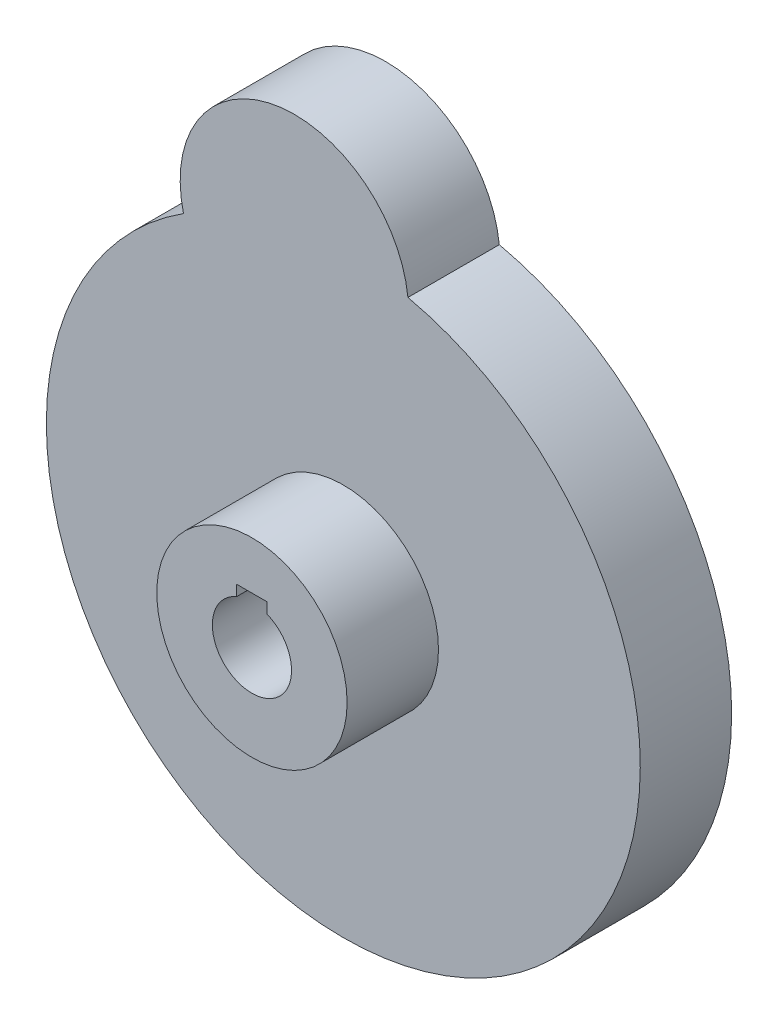
ISO-10303-21;
HEADER;
FILE_DESCRIPTION(('STEP AP214'),'2;1');
FILE_NAME('part.step','',(''),(''),'','','');
FILE_SCHEMA(('AUTOMOTIVE_DESIGN { 1 0 10303 214 1 1 1 1 }'));
ENDSEC;
DATA;
#1=APPLICATION_CONTEXT('core data for automotive mechanical design processes');
#2=APPLICATION_PROTOCOL_DEFINITION('international standard','automotive_design',2000,#1);
#3=PRODUCT_CONTEXT('',#1,'mechanical');
#4=PRODUCT('Part','Part','',(#3));
#5=PRODUCT_RELATED_PRODUCT_CATEGORY('part','',(#4));
#6=PRODUCT_DEFINITION_FORMATION('','',#4);
#7=PRODUCT_DEFINITION_CONTEXT('part definition',#1,'design');
#8=PRODUCT_DEFINITION('design','',#6,#7);
#9=PRODUCT_DEFINITION_SHAPE('','',#8);
#10=(LENGTH_UNIT() NAMED_UNIT(*) SI_UNIT(.MILLI.,.METRE.));
#11=(NAMED_UNIT(*) PLANE_ANGLE_UNIT() SI_UNIT($,.RADIAN.));
#12=(NAMED_UNIT(*) SI_UNIT($,.STERADIAN.) SOLID_ANGLE_UNIT());
#13=UNCERTAINTY_MEASURE_WITH_UNIT(LENGTH_MEASURE(1.E-05),#10,'distance_accuracy_value','');
#14=(GEOMETRIC_REPRESENTATION_CONTEXT(3) GLOBAL_UNCERTAINTY_ASSIGNED_CONTEXT((#13)) GLOBAL_UNIT_ASSIGNED_CONTEXT((#10,
#11,#12)) REPRESENTATION_CONTEXT('',''));
#15=CARTESIAN_POINT('',(0.,0.,0.));
#16=DIRECTION('',(0.,0.,1.));
#17=DIRECTION('',(1.,0.,0.));
#18=AXIS2_PLACEMENT_3D('',#15,#16,#17);
#19=CARTESIAN_POINT('',(0.,0.,-6.));
#20=DIRECTION('',(0.,0.,1.));
#21=DIRECTION('',(1.,0.,0.));
#22=AXIS2_PLACEMENT_3D('',#19,#20,#21);
#23=CYLINDRICAL_SURFACE('',#22,39.);
#24=DIRECTION('',(0.,0.,1.));
#25=VECTOR('',#24,1.);
#26=CARTESIAN_POINT('',(8.48645497929641,38.0654709925462,-6.));
#27=LINE('',#26,#25);
#28=CARTESIAN_POINT('',(8.48645497929641,38.0654709925462,-6.));
#29=VERTEX_POINT('',#28);
#30=CARTESIAN_POINT('',(8.48645497929641,38.0654709925462,6.));
#31=VERTEX_POINT('',#30);
#32=EDGE_CURVE('E63',#29,#31,#27,.T.);
#33=ORIENTED_EDGE('',*,*,#32,.T.);
#34=CARTESIAN_POINT('',(0.,0.,6.));
#35=DIRECTION('',(0.,0.,1.));
#36=DIRECTION('',(1.,0.,0.));
#37=AXIS2_PLACEMENT_3D('',#34,#35,#36);
#38=CIRCLE('',#37,39.);
#39=CARTESIAN_POINT('',(-20.9938169653065,32.8673036500899,6.));
#40=VERTEX_POINT('',#39);
#41=EDGE_CURVE('E141',#40,#31,#38,.T.);
#42=ORIENTED_EDGE('',*,*,#41,.F.);
#43=DIRECTION('',(0.,0.,1.));
#44=VECTOR('',#43,1.);
#45=CARTESIAN_POINT('',(-20.9938169653065,32.8673036500899,-6.));
#46=LINE('',#45,#44);
#47=CARTESIAN_POINT('',(-20.9938169653065,32.8673036500899,-6.));
#48=VERTEX_POINT('',#47);
#49=EDGE_CURVE('E55',#48,#40,#46,.T.);
#50=ORIENTED_EDGE('',*,*,#49,.F.);
#51=CARTESIAN_POINT('',(0.,0.,-6.));
#52=DIRECTION('',(0.,0.,1.));
#53=DIRECTION('',(1.,0.,0.));
#54=AXIS2_PLACEMENT_3D('',#51,#52,#53);
#55=CIRCLE('',#54,39.);
#56=EDGE_CURVE('E147',#48,#29,#55,.T.);
#57=ORIENTED_EDGE('',*,*,#56,.T.);
#58=EDGE_LOOP('',(#33,#42,#50,#57));
#59=FACE_BOUND('',#58,.T.);
#60=ADVANCED_FACE('F41',(#59),#23,.T.);
#61=CARTESIAN_POINT('',(-6.42498257367646,36.4378868614517,-6.));
#62=DIRECTION('',(0.,0.,1.));
#63=DIRECTION('',(1.,0.,0.));
#64=AXIS2_PLACEMENT_3D('',#61,#62,#63);
#65=CYLINDRICAL_SURFACE('',#64,15.);
#66=ORIENTED_EDGE('',*,*,#49,.T.);
#67=CARTESIAN_POINT('',(-6.42498257367646,36.4378868614517,6.));
#68=DIRECTION('',(0.,0.,1.));
#69=DIRECTION('',(1.,0.,0.));
#70=AXIS2_PLACEMENT_3D('',#67,#68,#69);
#71=CIRCLE('',#70,15.);
#72=EDGE_CURVE('E144',#31,#40,#71,.T.);
#73=ORIENTED_EDGE('',*,*,#72,.F.);
#74=ORIENTED_EDGE('',*,*,#32,.F.);
#75=CARTESIAN_POINT('',(-6.42498257367646,36.4378868614517,-6.));
#76=DIRECTION('',(0.,0.,1.));
#77=DIRECTION('',(1.,0.,0.));
#78=AXIS2_PLACEMENT_3D('',#75,#76,#77);
#79=CIRCLE('',#78,15.);
#80=EDGE_CURVE('E149',#29,#48,#79,.T.);
#81=ORIENTED_EDGE('',*,*,#80,.T.);
#82=EDGE_LOOP('',(#66,#73,#74,#81));
#83=FACE_BOUND('',#82,.T.);
#84=ADVANCED_FACE('F156',(#83),#65,.T.);
#85=CARTESIAN_POINT('',(0.,0.,-6.));
#86=DIRECTION('',(0.,0.,1.));
#87=DIRECTION('',(1.,0.,0.));
#88=AXIS2_PLACEMENT_3D('',#85,#86,#87);
#89=PLANE('',#88);
#90=CARTESIAN_POINT('',(0.,0.,-6.));
#91=DIRECTION('',(0.,0.,1.));
#92=DIRECTION('',(1.,0.,0.));
#93=AXIS2_PLACEMENT_3D('',#90,#91,#92);
#94=CIRCLE('',#93,12.5);
#95=CARTESIAN_POINT('',(12.5,0.,-6.));
#96=VERTEX_POINT('',#95);
#97=EDGE_CURVE('E138',#96,#96,#94,.T.);
#98=ORIENTED_EDGE('',*,*,#97,.T.);
#99=EDGE_LOOP('',(#98));
#100=FACE_BOUND('',#99,.T.);
#101=ORIENTED_EDGE('',*,*,#56,.F.);
#102=ORIENTED_EDGE('',*,*,#80,.F.);
#103=EDGE_LOOP('',(#101,#102));
#104=FACE_BOUND('',#103,.T.);
#105=ADVANCED_FACE('F160',(#100,#104),#89,.F.);
#106=CARTESIAN_POINT('',(0.,0.,6.));
#107=DIRECTION('',(0.,0.,1.));
#108=DIRECTION('',(1.,0.,0.));
#109=AXIS2_PLACEMENT_3D('',#106,#107,#108);
#110=PLANE('',#109);
#111=CARTESIAN_POINT('',(0.,0.,6.));
#112=DIRECTION('',(0.,0.,1.));
#113=DIRECTION('',(1.,0.,0.));
#114=AXIS2_PLACEMENT_3D('',#111,#112,#113);
#115=CIRCLE('',#114,12.5);
#116=CARTESIAN_POINT('',(12.5,0.,6.));
#117=VERTEX_POINT('',#116);
#118=EDGE_CURVE('E11',#117,#117,#115,.T.);
#119=ORIENTED_EDGE('',*,*,#118,.F.);
#120=EDGE_LOOP('',(#119));
#121=FACE_BOUND('',#120,.T.);
#122=ORIENTED_EDGE('',*,*,#41,.T.);
#123=ORIENTED_EDGE('',*,*,#72,.T.);
#124=EDGE_LOOP('',(#122,#123));
#125=FACE_BOUND('',#124,.T.);
#126=ADVANCED_FACE('F158',(#121,#125),#110,.T.);
#127=CARTESIAN_POINT('',(0.,0.,18.));
#128=DIRECTION('',(0.,0.,1.));
#129=DIRECTION('',(1.,0.,0.));
#130=AXIS2_PLACEMENT_3D('',#127,#128,#129);
#131=PLANE('',#130);
#132=CARTESIAN_POINT('',(0.,0.,18.));
#133=DIRECTION('',(0.,0.,1.));
#134=DIRECTION('',(1.,0.,0.));
#135=AXIS2_PLACEMENT_3D('',#132,#133,#134);
#136=CIRCLE('',#135,5.2);
#137=CARTESIAN_POINT('',(-2.,4.8,18.));
#138=VERTEX_POINT('',#137);
#139=CARTESIAN_POINT('',(2.,4.8,18.));
#140=VERTEX_POINT('',#139);
#141=EDGE_CURVE('E97',#138,#140,#136,.T.);
#142=ORIENTED_EDGE('',*,*,#141,.F.);
#143=DIRECTION('',(0.,-1.,0.));
#144=VECTOR('',#143,1.);
#145=CARTESIAN_POINT('',(-2.,0.,18.));
#146=LINE('',#145,#144);
#147=CARTESIAN_POINT('',(-2.,6.2,18.));
#148=VERTEX_POINT('',#147);
#149=EDGE_CURVE('E112',#148,#138,#146,.T.);
#150=ORIENTED_EDGE('',*,*,#149,.F.);
#151=DIRECTION('',(1.,0.,0.));
#152=VECTOR('',#151,1.);
#153=CARTESIAN_POINT('',(0.,6.2,18.));
#154=LINE('',#153,#152);
#155=CARTESIAN_POINT('',(2.,6.2,18.));
#156=VERTEX_POINT('',#155);
#157=EDGE_CURVE('E118',#148,#156,#154,.T.);
#158=ORIENTED_EDGE('',*,*,#157,.T.);
#159=DIRECTION('',(0.,-1.,0.));
#160=VECTOR('',#159,1.);
#161=CARTESIAN_POINT('',(2.,0.,18.));
#162=LINE('',#161,#160);
#163=EDGE_CURVE('E114',#156,#140,#162,.T.);
#164=ORIENTED_EDGE('',*,*,#163,.T.);
#165=EDGE_LOOP('',(#142,#150,#158,#164));
#166=FACE_BOUND('',#165,.T.);
#167=CARTESIAN_POINT('',(0.,0.,18.));
#168=DIRECTION('',(0.,0.,1.));
#169=DIRECTION('',(1.,0.,0.));
#170=AXIS2_PLACEMENT_3D('',#167,#168,#169);
#171=CIRCLE('',#170,12.5);
#172=CARTESIAN_POINT('',(12.5,0.,18.));
#173=VERTEX_POINT('',#172);
#174=EDGE_CURVE('E123',#173,#173,#171,.T.);
#175=ORIENTED_EDGE('',*,*,#174,.T.);
#176=EDGE_LOOP('',(#175));
#177=FACE_BOUND('',#176,.T.);
#178=ADVANCED_FACE('F109',(#166,#177),#131,.T.);
#179=CARTESIAN_POINT('',(0.,0.,-18.));
#180=DIRECTION('',(0.,0.,1.));
#181=DIRECTION('',(1.,0.,0.));
#182=AXIS2_PLACEMENT_3D('',#179,#180,#181);
#183=CYLINDRICAL_SURFACE('',#182,12.5);
#184=ORIENTED_EDGE('',*,*,#118,.T.);
#185=EDGE_LOOP('',(#184));
#186=FACE_BOUND('',#185,.T.);
#187=ORIENTED_EDGE('',*,*,#174,.F.);
#188=EDGE_LOOP('',(#187));
#189=FACE_BOUND('',#188,.T.);
#190=ADVANCED_FACE('F167',(#186,#189),#183,.T.);
#191=CARTESIAN_POINT('',(-2.,0.,-6.));
#192=DIRECTION('',(-1.,0.,0.));
#193=DIRECTION('',(0.,-1.,0.));
#194=AXIS2_PLACEMENT_3D('',#191,#192,#193);
#195=PLANE('',#194);
#196=DIRECTION('',(0.,0.,1.));
#197=VECTOR('',#196,1.);
#198=CARTESIAN_POINT('',(-2.,6.2,-6.));
#199=LINE('',#198,#197);
#200=CARTESIAN_POINT('',(-2.,6.2,-18.));
#201=VERTEX_POINT('',#200);
#202=EDGE_CURVE('E104',#201,#148,#199,.T.);
#203=ORIENTED_EDGE('',*,*,#202,.T.);
#204=ORIENTED_EDGE('',*,*,#149,.T.);
#205=DIRECTION('',(0.,0.,1.));
#206=VECTOR('',#205,1.);
#207=CARTESIAN_POINT('',(-2.,4.8,-6.));
#208=LINE('',#207,#206);
#209=CARTESIAN_POINT('',(-2.,4.8,-18.));
#210=VERTEX_POINT('',#209);
#211=EDGE_CURVE('E94',#210,#138,#208,.T.);
#212=ORIENTED_EDGE('',*,*,#211,.F.);
#213=DIRECTION('',(0.,-1.,0.));
#214=VECTOR('',#213,1.);
#215=CARTESIAN_POINT('',(-2.,0.,-18.));
#216=LINE('',#215,#214);
#217=EDGE_CURVE('E127',#201,#210,#216,.T.);
#218=ORIENTED_EDGE('',*,*,#217,.F.);
#219=EDGE_LOOP('',(#203,#204,#212,#218));
#220=FACE_BOUND('',#219,.T.);
#221=ADVANCED_FACE('F116',(#220),#195,.F.);
#222=CARTESIAN_POINT('',(0.,6.2,-6.));
#223=DIRECTION('',(0.,-1.,0.));
#224=DIRECTION('',(0.,0.,-1.));
#225=AXIS2_PLACEMENT_3D('',#222,#223,#224);
#226=PLANE('',#225);
#227=DIRECTION('',(0.,0.,1.));
#228=VECTOR('',#227,1.);
#229=CARTESIAN_POINT('',(2.,6.2,-6.));
#230=LINE('',#229,#228);
#231=CARTESIAN_POINT('',(2.,6.2,-18.));
#232=VERTEX_POINT('',#231);
#233=EDGE_CURVE('E152',#232,#156,#230,.T.);
#234=ORIENTED_EDGE('',*,*,#233,.T.);
#235=ORIENTED_EDGE('',*,*,#157,.F.);
#236=ORIENTED_EDGE('',*,*,#202,.F.);
#237=DIRECTION('',(1.,0.,0.));
#238=VECTOR('',#237,1.);
#239=CARTESIAN_POINT('',(0.,6.2,-18.));
#240=LINE('',#239,#238);
#241=EDGE_CURVE('E129',#201,#232,#240,.T.);
#242=ORIENTED_EDGE('',*,*,#241,.T.);
#243=EDGE_LOOP('',(#234,#235,#236,#242));
#244=FACE_BOUND('',#243,.T.);
#245=ADVANCED_FACE('F186',(#244),#226,.T.);
#246=CARTESIAN_POINT('',(2.,0.,-6.));
#247=DIRECTION('',(-1.,0.,0.));
#248=DIRECTION('',(0.,-1.,0.));
#249=AXIS2_PLACEMENT_3D('',#246,#247,#248);
#250=PLANE('',#249);
#251=DIRECTION('',(0.,0.,1.));
#252=VECTOR('',#251,1.);
#253=CARTESIAN_POINT('',(2.,4.8,-6.));
#254=LINE('',#253,#252);
#255=CARTESIAN_POINT('',(2.,4.8,-18.));
#256=VERTEX_POINT('',#255);
#257=EDGE_CURVE('E48',#256,#140,#254,.T.);
#258=ORIENTED_EDGE('',*,*,#257,.T.);
#259=ORIENTED_EDGE('',*,*,#163,.F.);
#260=ORIENTED_EDGE('',*,*,#233,.F.);
#261=DIRECTION('',(0.,-1.,0.));
#262=VECTOR('',#261,1.);
#263=CARTESIAN_POINT('',(2.,0.,-18.));
#264=LINE('',#263,#262);
#265=EDGE_CURVE('E132',#232,#256,#264,.T.);
#266=ORIENTED_EDGE('',*,*,#265,.T.);
#267=EDGE_LOOP('',(#258,#259,#260,#266));
#268=FACE_BOUND('',#267,.T.);
#269=ADVANCED_FACE('F183',(#268),#250,.T.);
#270=CARTESIAN_POINT('',(0.,0.,-6.));
#271=DIRECTION('',(0.,0.,1.));
#272=DIRECTION('',(1.,0.,0.));
#273=AXIS2_PLACEMENT_3D('',#270,#271,#272);
#274=CYLINDRICAL_SURFACE('',#273,5.2);
#275=ORIENTED_EDGE('',*,*,#211,.T.);
#276=ORIENTED_EDGE('',*,*,#141,.T.);
#277=ORIENTED_EDGE('',*,*,#257,.F.);
#278=CARTESIAN_POINT('',(0.,0.,-18.));
#279=DIRECTION('',(0.,0.,1.));
#280=DIRECTION('',(1.,0.,0.));
#281=AXIS2_PLACEMENT_3D('',#278,#279,#280);
#282=CIRCLE('',#281,5.2);
#283=EDGE_CURVE('E99',#210,#256,#282,.T.);
#284=ORIENTED_EDGE('',*,*,#283,.F.);
#285=EDGE_LOOP('',(#275,#276,#277,#284));
#286=FACE_BOUND('',#285,.T.);
#287=ADVANCED_FACE('F96',(#286),#274,.F.);
#288=CARTESIAN_POINT('',(0.,0.,-18.));
#289=DIRECTION('',(0.,0.,1.));
#290=DIRECTION('',(1.,0.,0.));
#291=AXIS2_PLACEMENT_3D('',#288,#289,#290);
#292=CIRCLE('',#291,12.5);
#293=CARTESIAN_POINT('',(12.5,0.,-18.));
#294=VERTEX_POINT('',#293);
#295=EDGE_CURVE('E135',#294,#294,#292,.T.);
#296=ORIENTED_EDGE('',*,*,#295,.T.);
#297=EDGE_LOOP('',(#296));
#298=FACE_BOUND('',#297,.T.);
#299=ORIENTED_EDGE('',*,*,#97,.F.);
#300=EDGE_LOOP('',(#299));
#301=FACE_BOUND('',#300,.T.);
#302=ADVANCED_FACE('F182',(#298,#301),#183,.T.);
#303=CARTESIAN_POINT('',(0.,0.,-18.));
#304=DIRECTION('',(0.,0.,1.));
#305=DIRECTION('',(1.,0.,0.));
#306=AXIS2_PLACEMENT_3D('',#303,#304,#305);
#307=PLANE('',#306);
#308=ORIENTED_EDGE('',*,*,#283,.T.);
#309=ORIENTED_EDGE('',*,*,#265,.F.);
#310=ORIENTED_EDGE('',*,*,#241,.F.);
#311=ORIENTED_EDGE('',*,*,#217,.T.);
#312=EDGE_LOOP('',(#308,#309,#310,#311));
#313=FACE_BOUND('',#312,.T.);
#314=ORIENTED_EDGE('',*,*,#295,.F.);
#315=EDGE_LOOP('',(#314));
#316=FACE_BOUND('',#315,.T.);
#317=ADVANCED_FACE('F196',(#313,#316),#307,.F.);
#318=CLOSED_SHELL('',(#60,#84,#105,#126,#178,#190,#221,#245,#269,#287,#302,#317));
#319=MANIFOLD_SOLID_BREP('B2',#318);
#320=ADVANCED_BREP_SHAPE_REPRESENTATION('',(#18,#319),#14);
#321=SHAPE_DEFINITION_REPRESENTATION(#9,#320);
ENDSEC;
END-ISO-10303-21;
